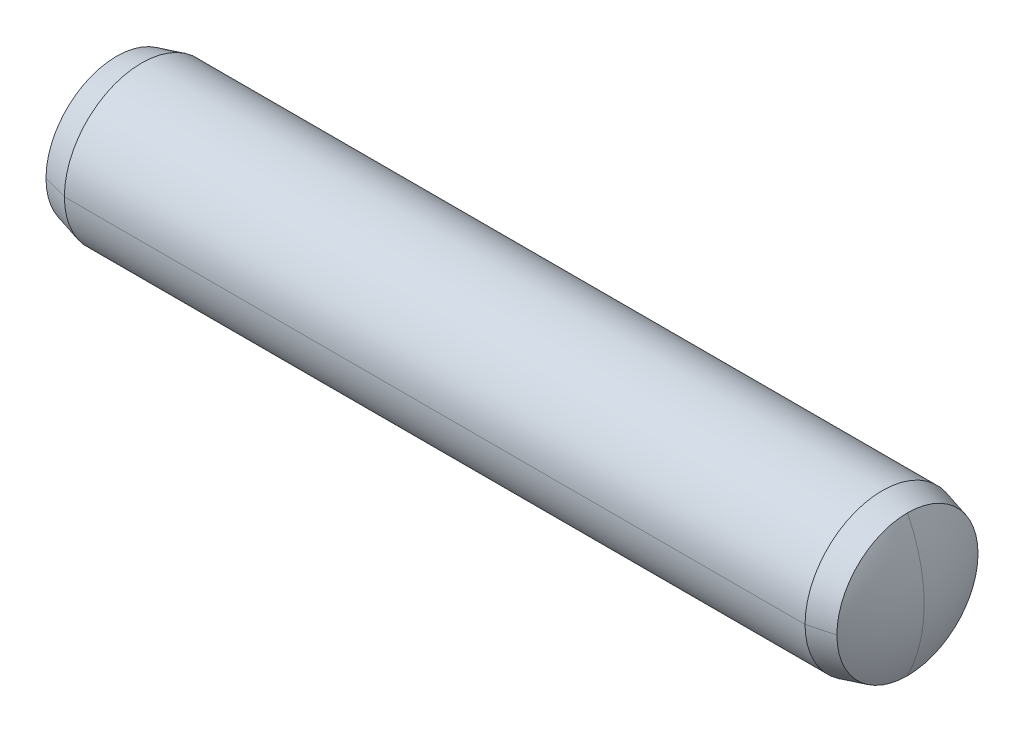
ISO-10303-21;
HEADER;
FILE_DESCRIPTION(('STEP AP214'),'2;1');
FILE_NAME('part.step','',(''),(''),'','','');
FILE_SCHEMA(('AUTOMOTIVE_DESIGN { 1 0 10303 214 1 1 1 1 }'));
ENDSEC;
DATA;
#1=APPLICATION_CONTEXT('core data for automotive mechanical design processes');
#2=APPLICATION_PROTOCOL_DEFINITION('international standard','automotive_design',2000,#1);
#3=PRODUCT_CONTEXT('',#1,'mechanical');
#4=PRODUCT('Part','Part','',(#3));
#5=PRODUCT_RELATED_PRODUCT_CATEGORY('part','',(#4));
#6=PRODUCT_DEFINITION_FORMATION('','',#4);
#7=PRODUCT_DEFINITION_CONTEXT('part definition',#1,'design');
#8=PRODUCT_DEFINITION('design','',#6,#7);
#9=PRODUCT_DEFINITION_SHAPE('','',#8);
#10=(LENGTH_UNIT() NAMED_UNIT(*) SI_UNIT(.MILLI.,.METRE.));
#11=(NAMED_UNIT(*) PLANE_ANGLE_UNIT() SI_UNIT($,.RADIAN.));
#12=(NAMED_UNIT(*) SI_UNIT($,.STERADIAN.) SOLID_ANGLE_UNIT());
#13=UNCERTAINTY_MEASURE_WITH_UNIT(LENGTH_MEASURE(1.E-05),#10,'distance_accuracy_value','');
#14=(GEOMETRIC_REPRESENTATION_CONTEXT(3) GLOBAL_UNCERTAINTY_ASSIGNED_CONTEXT((#13)) GLOBAL_UNIT_ASSIGNED_CONTEXT((#10,
#11,#12)) REPRESENTATION_CONTEXT('',''));
#15=CARTESIAN_POINT('',(0.,0.,0.));
#16=DIRECTION('',(0.,0.,1.));
#17=DIRECTION('',(1.,0.,0.));
#18=AXIS2_PLACEMENT_3D('',#15,#16,#17);
#19=CARTESIAN_POINT('',(-4.95259652750102,0.,0.));
#20=DIRECTION('',(0.,0.,1.));
#21=DIRECTION('',(0.,1.,0.));
#22=AXIS2_PLACEMENT_3D('',#19,#20,#21);
#23=SPHERICAL_SURFACE('',#22,3.04740347249898);
#24=CARTESIAN_POINT('',(-4.95259652750102,0.,0.));
#25=DIRECTION('',(0.,0.,1.));
#26=DIRECTION('',(0.,-1.,0.));
#27=AXIS2_PLACEMENT_3D('',#24,#25,#26);
#28=CIRCLE('',#27,3.04740347249898);
#29=CARTESIAN_POINT('',(-8.,0.,0.));
#30=VERTEX_POINT('',#29);
#31=CARTESIAN_POINT('',(-7.675,-1.36937476868983,0.));
#32=VERTEX_POINT('',#31);
#33=EDGE_CURVE('E85',#30,#32,#28,.T.);
#34=ORIENTED_EDGE('',*,*,#33,.F.);
#35=CARTESIAN_POINT('',(-4.95259652750102,0.,0.));
#36=DIRECTION('',(0.,0.,-1.));
#37=DIRECTION('',(-1.,0.,0.));
#38=AXIS2_PLACEMENT_3D('',#35,#36,#37);
#39=CIRCLE('',#38,3.04740347249898);
#40=CARTESIAN_POINT('',(-7.675,1.36937476868983,0.));
#41=VERTEX_POINT('',#40);
#42=EDGE_CURVE('E87',#30,#41,#39,.T.);
#43=ORIENTED_EDGE('',*,*,#42,.T.);
#44=CARTESIAN_POINT('',(-7.675,0.,0.));
#45=DIRECTION('',(-1.,0.,0.));
#46=DIRECTION('',(0.,0.,1.));
#47=AXIS2_PLACEMENT_3D('',#44,#45,#46);
#48=CIRCLE('',#47,1.36937476868983);
#49=CARTESIAN_POINT('',(-7.675,0.,-1.36937476868983));
#50=VERTEX_POINT('',#49);
#51=EDGE_CURVE('E11',#41,#50,#48,.T.);
#52=ORIENTED_EDGE('',*,*,#51,.T.);
#53=CARTESIAN_POINT('',(-7.675,0.,0.));
#54=DIRECTION('',(-1.,0.,0.));
#55=DIRECTION('',(0.,0.,1.));
#56=AXIS2_PLACEMENT_3D('',#53,#54,#55);
#57=CIRCLE('',#56,1.36937476868983);
#58=EDGE_CURVE('E89',#50,#32,#57,.T.);
#59=ORIENTED_EDGE('',*,*,#58,.T.);
#60=EDGE_LOOP('',(#34,#43,#52,#59));
#61=FACE_BOUND('',#60,.T.);
#62=ADVANCED_FACE('F16',(#61),#23,.T.);
#63=CARTESIAN_POINT('',(-7.1875,0.,0.));
#64=DIRECTION('',(1.,0.,0.));
#65=DIRECTION('',(0.,0.,1.));
#66=AXIS2_PLACEMENT_3D('',#63,#64,#65);
#67=CONICAL_SURFACE('',#66,1.5,0.261799387799151);
#68=DIRECTION('',(0.965925826289068,0.,-0.258819045102522));
#69=VECTOR('',#68,1.);
#70=CARTESIAN_POINT('',(-7.1875,0.,-1.5));
#71=LINE('',#70,#69);
#72=CARTESIAN_POINT('',(-7.1875,0.,-1.5));
#73=VERTEX_POINT('',#72);
#74=EDGE_CURVE('E155',#50,#73,#71,.T.);
#75=ORIENTED_EDGE('',*,*,#74,.F.);
#76=ORIENTED_EDGE('',*,*,#51,.F.);
#77=CARTESIAN_POINT('',(-7.675,0.,0.));
#78=DIRECTION('',(-1.,0.,0.));
#79=DIRECTION('',(0.,0.,1.));
#80=AXIS2_PLACEMENT_3D('',#77,#78,#79);
#81=CIRCLE('',#80,1.36937476868983);
#82=CARTESIAN_POINT('',(-7.675,0.,1.36937476868983));
#83=VERTEX_POINT('',#82);
#84=EDGE_CURVE('E99',#83,#41,#81,.T.);
#85=ORIENTED_EDGE('',*,*,#84,.F.);
#86=DIRECTION('',(0.965925826289068,0.,0.258819045102522));
#87=VECTOR('',#86,1.);
#88=CARTESIAN_POINT('',(-7.1875,0.,1.5));
#89=LINE('',#88,#87);
#90=CARTESIAN_POINT('',(-7.1875,0.,1.5));
#91=VERTEX_POINT('',#90);
#92=EDGE_CURVE('E154',#83,#91,#89,.T.);
#93=ORIENTED_EDGE('',*,*,#92,.T.);
#94=CARTESIAN_POINT('',(-7.1875,0.,0.));
#95=DIRECTION('',(-1.,0.,0.));
#96=DIRECTION('',(0.,0.,1.));
#97=AXIS2_PLACEMENT_3D('',#94,#95,#96);
#98=CIRCLE('',#97,1.5);
#99=EDGE_CURVE('E112',#91,#73,#98,.T.);
#100=ORIENTED_EDGE('',*,*,#99,.T.);
#101=EDGE_LOOP('',(#75,#76,#85,#93,#100));
#102=FACE_BOUND('',#101,.T.);
#103=ADVANCED_FACE('F236',(#102),#67,.T.);
#104=CARTESIAN_POINT('',(4.95259652750102,0.,0.));
#105=DIRECTION('',(0.,0.,-1.));
#106=DIRECTION('',(0.,1.,0.));
#107=AXIS2_PLACEMENT_3D('',#104,#105,#106);
#108=SPHERICAL_SURFACE('',#107,3.04740347249898);
#109=CARTESIAN_POINT('',(4.95259652750102,0.,0.));
#110=DIRECTION('',(0.,0.,-1.));
#111=DIRECTION('',(0.,1.,0.));
#112=AXIS2_PLACEMENT_3D('',#109,#110,#111);
#113=CIRCLE('',#112,3.04740347249898);
#114=CARTESIAN_POINT('',(8.,0.,0.));
#115=VERTEX_POINT('',#114);
#116=CARTESIAN_POINT('',(7.675,-1.36937476868983,0.));
#117=VERTEX_POINT('',#116);
#118=EDGE_CURVE('E140',#115,#117,#113,.T.);
#119=ORIENTED_EDGE('',*,*,#118,.F.);
#120=CARTESIAN_POINT('',(4.95259652750102,0.,0.));
#121=DIRECTION('',(0.,0.,1.));
#122=DIRECTION('',(1.,0.,0.));
#123=AXIS2_PLACEMENT_3D('',#120,#121,#122);
#124=CIRCLE('',#123,3.04740347249898);
#125=CARTESIAN_POINT('',(7.675,1.36937476868983,0.));
#126=VERTEX_POINT('',#125);
#127=EDGE_CURVE('E148',#115,#126,#124,.T.);
#128=ORIENTED_EDGE('',*,*,#127,.T.);
#129=CARTESIAN_POINT('',(7.675,0.,0.));
#130=DIRECTION('',(-1.,0.,0.));
#131=DIRECTION('',(0.,0.,1.));
#132=AXIS2_PLACEMENT_3D('',#129,#130,#131);
#133=CIRCLE('',#132,1.36937476868983);
#134=CARTESIAN_POINT('',(7.675,0.,1.36937476868983));
#135=VERTEX_POINT('',#134);
#136=EDGE_CURVE('E117',#135,#126,#133,.T.);
#137=ORIENTED_EDGE('',*,*,#136,.F.);
#138=CARTESIAN_POINT('',(7.675,0.,0.));
#139=DIRECTION('',(-1.,0.,0.));
#140=DIRECTION('',(0.,0.,1.));
#141=AXIS2_PLACEMENT_3D('',#138,#139,#140);
#142=CIRCLE('',#141,1.36937476868983);
#143=EDGE_CURVE('E27',#117,#135,#142,.T.);
#144=ORIENTED_EDGE('',*,*,#143,.F.);
#145=EDGE_LOOP('',(#119,#128,#137,#144));
#146=FACE_BOUND('',#145,.T.);
#147=ADVANCED_FACE('F231',(#146),#108,.T.);
#148=CARTESIAN_POINT('',(7.1875,0.,0.));
#149=DIRECTION('',(-1.,0.,0.));
#150=DIRECTION('',(0.,0.,1.));
#151=AXIS2_PLACEMENT_3D('',#148,#149,#150);
#152=CONICAL_SURFACE('',#151,1.5,0.261799387799151);
#153=DIRECTION('',(-0.965925826289068,0.,-0.258819045102522));
#154=VECTOR('',#153,1.);
#155=CARTESIAN_POINT('',(7.1875,0.,-1.5));
#156=LINE('',#155,#154);
#157=CARTESIAN_POINT('',(7.675,0.,-1.36937476868983));
#158=VERTEX_POINT('',#157);
#159=CARTESIAN_POINT('',(7.1875,0.,-1.5));
#160=VERTEX_POINT('',#159);
#161=EDGE_CURVE('E120',#158,#160,#156,.T.);
#162=ORIENTED_EDGE('',*,*,#161,.F.);
#163=CARTESIAN_POINT('',(7.675,0.,0.));
#164=DIRECTION('',(-1.,0.,0.));
#165=DIRECTION('',(0.,0.,1.));
#166=AXIS2_PLACEMENT_3D('',#163,#164,#165);
#167=CIRCLE('',#166,1.36937476868983);
#168=EDGE_CURVE('E133',#158,#117,#167,.T.);
#169=ORIENTED_EDGE('',*,*,#168,.T.);
#170=ORIENTED_EDGE('',*,*,#143,.T.);
#171=DIRECTION('',(-0.965925826289068,0.,0.258819045102522));
#172=VECTOR('',#171,1.);
#173=CARTESIAN_POINT('',(7.1875,0.,1.5));
#174=LINE('',#173,#172);
#175=CARTESIAN_POINT('',(7.1875,0.,1.5));
#176=VERTEX_POINT('',#175);
#177=EDGE_CURVE('E108',#135,#176,#174,.T.);
#178=ORIENTED_EDGE('',*,*,#177,.T.);
#179=CARTESIAN_POINT('',(7.1875,0.,0.));
#180=DIRECTION('',(-1.,0.,0.));
#181=DIRECTION('',(0.,0.,1.));
#182=AXIS2_PLACEMENT_3D('',#179,#180,#181);
#183=CIRCLE('',#182,1.5);
#184=EDGE_CURVE('E20',#160,#176,#183,.T.);
#185=ORIENTED_EDGE('',*,*,#184,.F.);
#186=EDGE_LOOP('',(#162,#169,#170,#178,#185));
#187=FACE_BOUND('',#186,.T.);
#188=ADVANCED_FACE('F235',(#187),#152,.T.);
#189=CARTESIAN_POINT('',(-8.,0.,0.));
#190=DIRECTION('',(1.,0.,0.));
#191=DIRECTION('',(0.,0.,-1.));
#192=AXIS2_PLACEMENT_3D('',#189,#190,#191);
#193=CYLINDRICAL_SURFACE('',#192,1.5);
#194=DIRECTION('',(1.,0.,0.));
#195=VECTOR('',#194,1.);
#196=CARTESIAN_POINT('',(-8.,0.,1.5));
#197=LINE('',#196,#195);
#198=EDGE_CURVE('E116',#91,#176,#197,.T.);
#199=ORIENTED_EDGE('',*,*,#198,.F.);
#200=CARTESIAN_POINT('',(-7.1875,0.,0.));
#201=DIRECTION('',(-1.,0.,0.));
#202=DIRECTION('',(0.,0.,1.));
#203=AXIS2_PLACEMENT_3D('',#200,#201,#202);
#204=CIRCLE('',#203,1.5);
#205=EDGE_CURVE('E150',#73,#91,#204,.T.);
#206=ORIENTED_EDGE('',*,*,#205,.F.);
#207=DIRECTION('',(1.,0.,0.));
#208=VECTOR('',#207,1.);
#209=CARTESIAN_POINT('',(-8.,0.,-1.5));
#210=LINE('',#209,#208);
#211=EDGE_CURVE('E114',#73,#160,#210,.T.);
#212=ORIENTED_EDGE('',*,*,#211,.T.);
#213=ORIENTED_EDGE('',*,*,#184,.T.);
#214=EDGE_LOOP('',(#199,#206,#212,#213));
#215=FACE_BOUND('',#214,.T.);
#216=ADVANCED_FACE('F266',(#215),#193,.T.);
#217=CARTESIAN_POINT('',(-8.,0.,0.));
#218=DIRECTION('',(1.,0.,0.));
#219=DIRECTION('',(0.,0.,-1.));
#220=AXIS2_PLACEMENT_3D('',#217,#218,#219);
#221=CYLINDRICAL_SURFACE('',#220,1.5);
#222=ORIENTED_EDGE('',*,*,#99,.F.);
#223=ORIENTED_EDGE('',*,*,#198,.T.);
#224=CARTESIAN_POINT('',(7.1875,0.,0.));
#225=DIRECTION('',(-1.,0.,0.));
#226=DIRECTION('',(0.,0.,1.));
#227=AXIS2_PLACEMENT_3D('',#224,#225,#226);
#228=CIRCLE('',#227,1.5);
#229=EDGE_CURVE('E113',#176,#160,#228,.T.);
#230=ORIENTED_EDGE('',*,*,#229,.T.);
#231=ORIENTED_EDGE('',*,*,#211,.F.);
#232=EDGE_LOOP('',(#222,#223,#230,#231));
#233=FACE_BOUND('',#232,.T.);
#234=ADVANCED_FACE('F18',(#233),#221,.T.);
#235=CARTESIAN_POINT('',(7.1875,0.,0.));
#236=DIRECTION('',(-1.,0.,0.));
#237=DIRECTION('',(0.,0.,1.));
#238=AXIS2_PLACEMENT_3D('',#235,#236,#237);
#239=CONICAL_SURFACE('',#238,1.5,0.261799387799151);
#240=ORIENTED_EDGE('',*,*,#136,.T.);
#241=CARTESIAN_POINT('',(7.675,0.,0.));
#242=DIRECTION('',(-1.,0.,0.));
#243=DIRECTION('',(0.,0.,1.));
#244=AXIS2_PLACEMENT_3D('',#241,#242,#243);
#245=CIRCLE('',#244,1.36937476868983);
#246=EDGE_CURVE('E121',#126,#158,#245,.T.);
#247=ORIENTED_EDGE('',*,*,#246,.T.);
#248=ORIENTED_EDGE('',*,*,#161,.T.);
#249=ORIENTED_EDGE('',*,*,#229,.F.);
#250=ORIENTED_EDGE('',*,*,#177,.F.);
#251=EDGE_LOOP('',(#240,#247,#248,#249,#250));
#252=FACE_BOUND('',#251,.T.);
#253=ADVANCED_FACE('F253',(#252),#239,.T.);
#254=CARTESIAN_POINT('',(4.95259652750102,0.,0.));
#255=DIRECTION('',(0.,0.,-1.));
#256=DIRECTION('',(0.,1.,0.));
#257=AXIS2_PLACEMENT_3D('',#254,#255,#256);
#258=SPHERICAL_SURFACE('',#257,3.04740347249898);
#259=ORIENTED_EDGE('',*,*,#127,.F.);
#260=ORIENTED_EDGE('',*,*,#118,.T.);
#261=ORIENTED_EDGE('',*,*,#168,.F.);
#262=ORIENTED_EDGE('',*,*,#246,.F.);
#263=EDGE_LOOP('',(#259,#260,#261,#262));
#264=FACE_BOUND('',#263,.T.);
#265=ADVANCED_FACE('F249',(#264),#258,.T.);
#266=CARTESIAN_POINT('',(-7.1875,0.,0.));
#267=DIRECTION('',(1.,0.,0.));
#268=DIRECTION('',(0.,0.,1.));
#269=AXIS2_PLACEMENT_3D('',#266,#267,#268);
#270=CONICAL_SURFACE('',#269,1.5,0.261799387799151);
#271=ORIENTED_EDGE('',*,*,#58,.F.);
#272=ORIENTED_EDGE('',*,*,#74,.T.);
#273=ORIENTED_EDGE('',*,*,#205,.T.);
#274=ORIENTED_EDGE('',*,*,#92,.F.);
#275=CARTESIAN_POINT('',(-7.675,0.,0.));
#276=DIRECTION('',(-1.,0.,0.));
#277=DIRECTION('',(0.,0.,1.));
#278=AXIS2_PLACEMENT_3D('',#275,#276,#277);
#279=CIRCLE('',#278,1.36937476868983);
#280=EDGE_CURVE('E94',#32,#83,#279,.T.);
#281=ORIENTED_EDGE('',*,*,#280,.F.);
#282=EDGE_LOOP('',(#271,#272,#273,#274,#281));
#283=FACE_BOUND('',#282,.T.);
#284=ADVANCED_FACE('F244',(#283),#270,.T.);
#285=CARTESIAN_POINT('',(-4.95259652750102,0.,0.));
#286=DIRECTION('',(0.,0.,1.));
#287=DIRECTION('',(0.,1.,0.));
#288=AXIS2_PLACEMENT_3D('',#285,#286,#287);
#289=SPHERICAL_SURFACE('',#288,3.04740347249898);
#290=ORIENTED_EDGE('',*,*,#42,.F.);
#291=ORIENTED_EDGE('',*,*,#33,.T.);
#292=ORIENTED_EDGE('',*,*,#280,.T.);
#293=ORIENTED_EDGE('',*,*,#84,.T.);
#294=EDGE_LOOP('',(#290,#291,#292,#293));
#295=FACE_BOUND('',#294,.T.);
#296=ADVANCED_FACE('F97',(#295),#289,.T.);
#297=CLOSED_SHELL('',(#62,#103,#147,#188,#216,#234,#253,#265,#284,#296));
#298=MANIFOLD_SOLID_BREP('B1',#297);
#299=ADVANCED_BREP_SHAPE_REPRESENTATION('',(#18,#298),#14);
#300=SHAPE_DEFINITION_REPRESENTATION(#9,#299);
ENDSEC;
END-ISO-10303-21;
